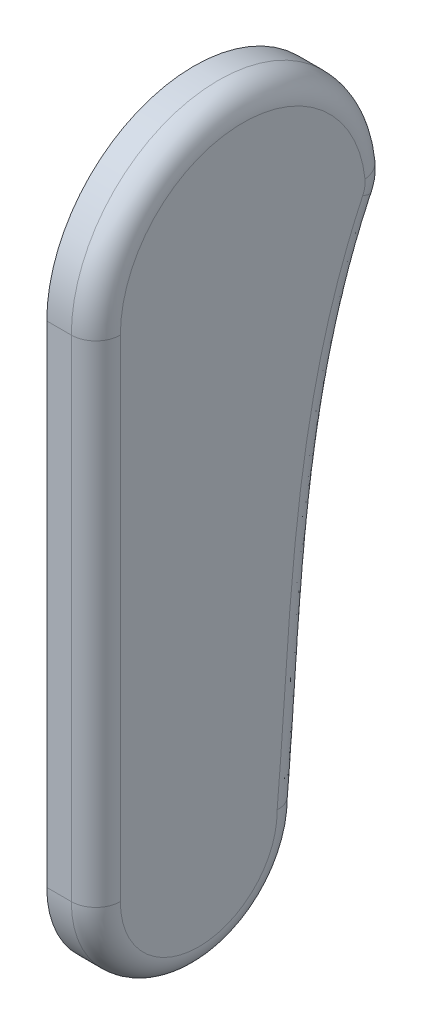
ISO-10303-21;
HEADER;
FILE_DESCRIPTION(('STEP AP214'),'2;1');
FILE_NAME('part.step','',(''),(''),'','','');
FILE_SCHEMA(('AUTOMOTIVE_DESIGN { 1 0 10303 214 1 1 1 1 }'));
ENDSEC;
DATA;
#1=APPLICATION_CONTEXT('core data for automotive mechanical design processes');
#2=APPLICATION_PROTOCOL_DEFINITION('international standard','automotive_design',2000,#1);
#3=PRODUCT_CONTEXT('',#1,'mechanical');
#4=PRODUCT('Part','Part','',(#3));
#5=PRODUCT_RELATED_PRODUCT_CATEGORY('part','',(#4));
#6=PRODUCT_DEFINITION_FORMATION('','',#4);
#7=PRODUCT_DEFINITION_CONTEXT('part definition',#1,'design');
#8=PRODUCT_DEFINITION('design','',#6,#7);
#9=PRODUCT_DEFINITION_SHAPE('','',#8);
#10=(LENGTH_UNIT() NAMED_UNIT(*) SI_UNIT(.MILLI.,.METRE.));
#11=(NAMED_UNIT(*) PLANE_ANGLE_UNIT() SI_UNIT($,.RADIAN.));
#12=(NAMED_UNIT(*) SI_UNIT($,.STERADIAN.) SOLID_ANGLE_UNIT());
#13=UNCERTAINTY_MEASURE_WITH_UNIT(LENGTH_MEASURE(1.E-05),#10,'distance_accuracy_value','');
#14=(GEOMETRIC_REPRESENTATION_CONTEXT(3) GLOBAL_UNCERTAINTY_ASSIGNED_CONTEXT((#13)) GLOBAL_UNIT_ASSIGNED_CONTEXT((#10,
#11,#12)) REPRESENTATION_CONTEXT('',''));
#15=CARTESIAN_POINT('',(0.,0.,0.));
#16=DIRECTION('',(0.,0.,1.));
#17=DIRECTION('',(1.,0.,0.));
#18=AXIS2_PLACEMENT_3D('',#15,#16,#17);
#19=CARTESIAN_POINT('',(10.,50.,0.));
#20=DIRECTION('',(-1.,0.,0.));
#21=DIRECTION('',(0.,0.,1.));
#22=AXIS2_PLACEMENT_3D('',#19,#20,#21);
#23=CYLINDRICAL_SURFACE('',#22,30.);
#24=DIRECTION('',(-1.,0.,0.));
#25=VECTOR('',#24,1.);
#26=CARTESIAN_POINT('',(10.,50.,30.));
#27=LINE('',#26,#25);
#28=CARTESIAN_POINT('',(5.,50.,30.));
#29=VERTEX_POINT('',#28);
#30=CARTESIAN_POINT('',(0.,50.,30.));
#31=VERTEX_POINT('',#30);
#32=EDGE_CURVE('E99',#29,#31,#27,.T.);
#33=ORIENTED_EDGE('',*,*,#32,.F.);
#34=CARTESIAN_POINT('',(5.,50.,0.));
#35=DIRECTION('',(-1.,0.,0.));
#36=DIRECTION('',(0.,0.,1.));
#37=AXIS2_PLACEMENT_3D('',#34,#35,#36);
#38=CIRCLE('',#37,30.);
#39=CARTESIAN_POINT('',(5.,53.1140673162585,-29.8379386813133));
#40=VERTEX_POINT('',#39);
#41=EDGE_CURVE('E65',#29,#40,#38,.T.);
#42=ORIENTED_EDGE('',*,*,#41,.T.);
#43=DIRECTION('',(-1.,0.,0.));
#44=VECTOR('',#43,1.);
#45=CARTESIAN_POINT('',(10.,53.1140673162585,-29.8379386813133));
#46=LINE('',#45,#44);
#47=CARTESIAN_POINT('',(0.,53.1140673162585,-29.8379386813133));
#48=VERTEX_POINT('',#47);
#49=EDGE_CURVE('E122',#40,#48,#46,.T.);
#50=ORIENTED_EDGE('',*,*,#49,.T.);
#51=CARTESIAN_POINT('',(0.,50.,0.));
#52=DIRECTION('',(1.,0.,0.));
#53=DIRECTION('',(0.,0.,1.));
#54=AXIS2_PLACEMENT_3D('',#51,#52,#53);
#55=CIRCLE('',#54,30.);
#56=EDGE_CURVE('E116',#48,#31,#55,.T.);
#57=ORIENTED_EDGE('',*,*,#56,.T.);
#58=EDGE_LOOP('',(#33,#42,#50,#57));
#59=FACE_BOUND('',#58,.T.);
#60=ADVANCED_FACE('F36',(#59),#23,.T.);
#61=CARTESIAN_POINT('',(10.,50.,30.));
#62=DIRECTION('',(0.,0.,-1.));
#63=DIRECTION('',(0.,1.,0.));
#64=AXIS2_PLACEMENT_3D('',#61,#62,#63);
#65=PLANE('',#64);
#66=DIRECTION('',(-1.,0.,0.));
#67=VECTOR('',#66,1.);
#68=CARTESIAN_POINT('',(10.,-50.,30.));
#69=LINE('',#68,#67);
#70=CARTESIAN_POINT('',(5.,-50.,30.));
#71=VERTEX_POINT('',#70);
#72=CARTESIAN_POINT('',(0.,-50.,30.));
#73=VERTEX_POINT('',#72);
#74=EDGE_CURVE('E109',#71,#73,#69,.T.);
#75=ORIENTED_EDGE('',*,*,#74,.F.);
#76=DIRECTION('',(0.,-1.,0.));
#77=VECTOR('',#76,1.);
#78=CARTESIAN_POINT('',(5.,50.,30.));
#79=LINE('',#78,#77);
#80=EDGE_CURVE('E110',#71,#29,#79,.F.);
#81=ORIENTED_EDGE('',*,*,#80,.T.);
#82=ORIENTED_EDGE('',*,*,#32,.T.);
#83=DIRECTION('',(0.,-1.,0.));
#84=VECTOR('',#83,1.);
#85=CARTESIAN_POINT('',(0.,50.,30.));
#86=LINE('',#85,#84);
#87=EDGE_CURVE('E104',#31,#73,#86,.T.);
#88=ORIENTED_EDGE('',*,*,#87,.T.);
#89=EDGE_LOOP('',(#75,#81,#82,#88));
#90=FACE_BOUND('',#89,.T.);
#91=ADVANCED_FACE('F101',(#90),#65,.F.);
#92=CARTESIAN_POINT('',(10.,-50.,9.02085164582259));
#93=DIRECTION('',(-1.,0.,0.));
#94=DIRECTION('',(0.,0.,1.));
#95=AXIS2_PLACEMENT_3D('',#92,#93,#94);
#96=CYLINDRICAL_SURFACE('',#95,20.9791483541774);
#97=DIRECTION('',(-1.,0.,0.));
#98=VECTOR('',#97,1.);
#99=CARTESIAN_POINT('',(10.,-50.,-11.9582967083548));
#100=LINE('',#99,#98);
#101=CARTESIAN_POINT('',(5.,-50.,-11.9582967083548));
#102=VERTEX_POINT('',#101);
#103=CARTESIAN_POINT('',(0.,-50.,-11.9582967083548));
#104=VERTEX_POINT('',#103);
#105=EDGE_CURVE('E147',#102,#104,#100,.T.);
#106=ORIENTED_EDGE('',*,*,#105,.F.);
#107=CARTESIAN_POINT('',(5.,-50.,9.02085164582259));
#108=DIRECTION('',(-1.,0.,0.));
#109=DIRECTION('',(0.,0.,1.));
#110=AXIS2_PLACEMENT_3D('',#107,#108,#109);
#111=CIRCLE('',#110,20.9791483541774);
#112=EDGE_CURVE('E235',#102,#71,#111,.T.);
#113=ORIENTED_EDGE('',*,*,#112,.T.);
#114=ORIENTED_EDGE('',*,*,#74,.T.);
#115=CARTESIAN_POINT('',(0.,-50.,9.02085164582259));
#116=DIRECTION('',(1.,0.,0.));
#117=DIRECTION('',(0.,0.,-1.));
#118=AXIS2_PLACEMENT_3D('',#115,#116,#117);
#119=CIRCLE('',#118,20.9791483541774);
#120=EDGE_CURVE('E118',#73,#104,#119,.T.);
#121=ORIENTED_EDGE('',*,*,#120,.T.);
#122=EDGE_LOOP('',(#106,#113,#114,#121));
#123=FACE_BOUND('',#122,.T.);
#124=ADVANCED_FACE('F217',(#123),#96,.T.);
#125=CARTESIAN_POINT('',(10.,-50.,-11.9582967083548));
#126=CARTESIAN_POINT('',(10.,-26.4513347294721,-14.0777009643891));
#127=CARTESIAN_POINT('',(10.,7.56200178607787,-14.6324379160143));
#128=CARTESIAN_POINT('',(10.,39.226803886699,-24.8825142699617));
#129=CARTESIAN_POINT('',(10.,47.8054191903359,-28.934179879079));
#130=B_SPLINE_CURVE_WITH_KNOTS('',3,(#125,#126,#127,#128,#129),.UNSPECIFIED.,.F.,.F.,(4,1,4),
(0.0235145948170748,0.72514656786816,1.),.UNSPECIFIED.);
#131=DIRECTION('',(-1.,0.,0.));
#132=VECTOR('',#131,1.);
#133=SURFACE_OF_LINEAR_EXTRUSION('',#130,#132);
#134=DIRECTION('',(-1.,0.,0.));
#135=VECTOR('',#134,1.);
#136=CARTESIAN_POINT('',(10.,47.8054191903359,-28.934179879079));
#137=LINE('',#136,#135);
#138=CARTESIAN_POINT('',(5.,47.8054191903359,-28.934179879079));
#139=VERTEX_POINT('',#138);
#140=CARTESIAN_POINT('',(0.,47.8054191903359,-28.934179879079));
#141=VERTEX_POINT('',#140);
#142=EDGE_CURVE('E144',#139,#141,#137,.T.);
#143=ORIENTED_EDGE('',*,*,#142,.F.);
#144=CARTESIAN_POINT('',(10.,73.8872969551826,-35.7229919191395));
#145=CARTESIAN_POINT('',(10.,71.7519841115977,-40.2441022982412));
#146=CARTESIAN_POINT('',(5.,71.7519841115977,-40.2441022982412));
#147=CARTESIAN_POINT('',(10.,65.9051086480953,-31.9530177794187));
#148=CARTESIAN_POINT('',(10.,63.7697957392722,-36.4741281277085));
#149=CARTESIAN_POINT('',(5.,63.7697957392722,-36.4741281277086));
#150=CARTESIAN_POINT('',(10.,57.922920341008,-28.183043639698));
#151=CARTESIAN_POINT('',(10.,55.7876073669467,-32.7041539571759));
#152=CARTESIAN_POINT('',(5.,55.7876073669467,-32.7041539571759));
#153=CARTESIAN_POINT('',(10.,49.9407320339208,-24.4130694999772));
#154=CARTESIAN_POINT('',(10.,47.8054189946213,-28.9341797866433));
#155=CARTESIAN_POINT('',(5.,47.8054189946213,-28.9341797866433));
#156=CARTESIAN_POINT('',(10.,48.93338079189,-23.9372754970616));
#157=CARTESIAN_POINT('',(10.,46.8408478290238,-28.4785934806703));
#158=CARTESIAN_POINT('',(5.,46.8408478290238,-28.4785934806703));
#159=CARTESIAN_POINT('',(10.,47.9192862922163,-23.4758298749053));
#160=CARTESIAN_POINT('',(10.,45.8692859154033,-28.0364906090797));
#161=CARTESIAN_POINT('',(5.,45.8692859154033,-28.0364906090797));
#162=CARTESIAN_POINT('',(10.,45.878803111166,-22.5811525083814));
#163=CARTESIAN_POINT('',(10.,43.913160956854,-27.1788003005188));
#164=CARTESIAN_POINT('',(5.,43.913160956854,-27.1788003005188));
#165=CARTESIAN_POINT('',(10.,44.8524152549784,-22.1479188827161));
#166=CARTESIAN_POINT('',(10.,42.9285987841157,-26.7632110955404));
#167=CARTESIAN_POINT('',(5.,42.9285987841156,-26.7632110955404));
#168=CARTESIAN_POINT('',(10.,42.7889844473,-21.3093555749802));
#169=CARTESIAN_POINT('',(10.,40.9478828804291,-25.9582628509131));
#170=CARTESIAN_POINT('',(5.,40.9478828804291,-25.9582628509131));
#171=CARTESIAN_POINT('',(10.,41.7519478259179,-20.9040103064838));
#172=CARTESIAN_POINT('',(10.,39.9517359940092,-25.5688891624172));
#173=CARTESIAN_POINT('',(5.,39.9517359940092,-25.5688891624172));
#174=CARTESIAN_POINT('',(10.,39.6677509013511,-20.1202731407733));
#175=CARTESIAN_POINT('',(10.,37.9482207436012,-24.8154913103112));
#176=CARTESIAN_POINT('',(5.,37.9482207436012,-24.8154913103112));
#177=CARTESIAN_POINT('',(10.,38.6205904302427,-19.7418816915146));
#178=CARTESIAN_POINT('',(10.,36.9408521934375,-24.4514675680035));
#179=CARTESIAN_POINT('',(5.,36.9408521934375,-24.4514675680035));
#180=CARTESIAN_POINT('',(10.,35.4741117020138,-18.648978166377));
#181=CARTESIAN_POINT('',(10.,33.911524484684,-23.3992555619152));
#182=CARTESIAN_POINT('',(5.,33.911524484684,-23.3992555619152));
#183=CARTESIAN_POINT('',(10.,33.3612060632632,-17.9732665296684));
#184=CARTESIAN_POINT('',(10.,31.8740996925733,-22.7475946117214));
#185=CARTESIAN_POINT('',(5.,31.8740996925733,-22.7475946117214));
#186=CARTESIAN_POINT('',(10.,29.1068905501268,-16.7182671285238));
#187=CARTESIAN_POINT('',(10.,27.764636811756,-21.5353269218243));
#188=CARTESIAN_POINT('',(5.,27.764636811756,-21.5353269218243));
#189=CARTESIAN_POINT('',(10.,26.9654765921235,-16.1389933421835));
#190=CARTESIAN_POINT('',(10.,25.6925937531463,-20.9747333820878));
#191=CARTESIAN_POINT('',(5.,25.6925937531463,-20.9747333820878));
#192=CARTESIAN_POINT('',(10.,22.6660774498272,-15.0695476057356));
#193=CARTESIAN_POINT('',(10.,21.5249239755849,-19.9380555366966));
#194=CARTESIAN_POINT('',(5.,21.5249239755848,-19.9380555366966));
#195=CARTESIAN_POINT('',(10.,20.5081443738661,-14.5791651386936));
#196=CARTESIAN_POINT('',(10.,19.429365795938,-19.4617716292313));
#197=CARTESIAN_POINT('',(5.,19.429365795938,-19.4617716292313));
#198=CARTESIAN_POINT('',(10.,16.176261998319,-13.6764042571045));
#199=CARTESIAN_POINT('',(10.,15.2148934433323,-18.5834759878851));
#200=CARTESIAN_POINT('',(5.,15.2148934433323,-18.5834759878851));
#201=CARTESIAN_POINT('',(10.,14.0023132353014,-13.2640232415366));
#202=CARTESIAN_POINT('',(10.,13.0959800516661,-18.1814617774323));
#203=CARTESIAN_POINT('',(5.,13.0959800516661,-18.1814617774323));
#204=CARTESIAN_POINT('',(10.,7.45859228737297,-12.1281536782276));
#205=CARTESIAN_POINT('',(10.,6.70598016154818,-17.0722937120038));
#206=CARTESIAN_POINT('',(5.,6.70598016154818,-17.0722937120038));
#207=CARTESIAN_POINT('',(10.,3.0710823137922,-11.5069256051738));
#208=CARTESIAN_POINT('',(10.,2.40564318449559,-16.4629730472704));
#209=CARTESIAN_POINT('',(5.,2.40564318449558,-16.4629730472705));
#210=CARTESIAN_POINT('',(10.,-5.7130041076635,-10.4559169434817));
#211=CARTESIAN_POINT('',(10.,-6.23572488046773,-15.4290324209686));
#212=CARTESIAN_POINT('',(5.,-6.23572488046772,-15.4290324209685));
#213=CARTESIAN_POINT('',(10.,-10.1095234240287,-10.0256201558454));
#214=CARTESIAN_POINT('',(10.,-10.5766134450412,-15.0039145256099));
#215=CARTESIAN_POINT('',(5.,-10.5766134450411,-15.0039145256093));
#216=CARTESIAN_POINT('',(10.,-18.9098479221754,-9.27125410761063));
#217=CARTESIAN_POINT('',(10.,-19.296904848253,-14.2564146094276));
#218=CARTESIAN_POINT('',(5.,-19.296904848253,-14.2564146094282));
#219=CARTESIAN_POINT('',(10.,-23.3136506231671,-8.94715409724267));
#220=CARTESIAN_POINT('',(10.,-23.6762961604362,-13.934002850319));
#221=CARTESIAN_POINT('',(5.,-23.6762961604364,-13.9340028503212));
#222=CARTESIAN_POINT('',(10.,-29.5382476317133,-8.50505763528955));
#223=CARTESIAN_POINT('',(10.,-29.8889765513778,-13.4927384351559));
#224=CARTESIAN_POINT('',(5.,-29.8889765513777,-13.492738435155));
#225=CARTESIAN_POINT('',(10.,-31.3584685191052,-8.37771178703263));
#226=CARTESIAN_POINT('',(10.,-31.708441663138,-13.3654481251371));
#227=CARTESIAN_POINT('',(5.,-31.7084416631378,-13.3654481251346));
#228=CARTESIAN_POINT('',(10.,-34.9987365190319,-8.12079273940109));
#229=CARTESIAN_POINT('',(10.,-35.3527871222883,-13.1082431445607));
#230=CARTESIAN_POINT('',(5.,-35.3527871222886,-13.1082431445631));
#231=CARTESIAN_POINT('',(10.,-36.8187836336732,-7.99121957178806));
#232=CARTESIAN_POINT('',(10.,-37.1776673921517,-12.9783285114213));
#233=CARTESIAN_POINT('',(5.,-37.1776673921525,-12.9783285114302));
#234=CARTESIAN_POINT('',(10.,-40.4583662913879,-7.72365912987904));
#235=CARTESIAN_POINT('',(10.,-40.8326629873264,-12.7096362934499));
#236=CARTESIAN_POINT('',(5.,-40.8326629873256,-12.7096362934411));
#237=CARTESIAN_POINT('',(10.,-42.2779018040432,-7.58567143170009));
#238=CARTESIAN_POINT('',(10.,-42.6627785719339,-12.5708582621065));
#239=CARTESIAN_POINT('',(5.,-42.6627785719309,-12.5708582620735));
#240=CARTESIAN_POINT('',(10.,-45.9158591065057,-7.29482003890449));
#241=CARTESIAN_POINT('',(10.,-46.3278633718317,-12.2778316724073));
#242=CARTESIAN_POINT('',(5.,-46.3278633718346,-12.2778316724403));
#243=CARTESIAN_POINT('',(10.,-47.7342808410477,-7.14195565815256));
#244=CARTESIAN_POINT('',(10.,-48.1628328071883,-12.1235824004843));
#245=CARTESIAN_POINT('',(5.,-48.1628328071994,-12.1235824006074));
#246=CARTESIAN_POINT('',(10.,-49.5518065134865,-6.97842496280876));
#247=CARTESIAN_POINT('',(10.,-49.9999997897036,-11.9582967269362));
#248=CARTESIAN_POINT('',(5.,-49.9999997897344,-11.9582967272789));
#249=CARTESIAN_POINT('',(10.,-51.0749034454428,-6.84134466207697));
#250=CARTESIAN_POINT('',(10.,-51.5230968382625,-11.8212164157101));
#251=CARTESIAN_POINT('',(5.,-51.5230968382826,-11.8212164159338));
#252=CARTESIAN_POINT('',(10.,-52.5980003773987,-6.70426436134043));
#253=CARTESIAN_POINT('',(10.,-53.0461938821737,-11.6841361048974));
#254=CARTESIAN_POINT('',(5.,-53.0461938821835,-11.6841361050069));
#255=CARTESIAN_POINT('',(10.,-89.289691386705,-3.40197418352203));
#256=CARTESIAN_POINT('',(10.,-89.7378874765488,-8.38184569442024));
#257=CARTESIAN_POINT('',(5.,-89.7378874763214,-8.38184569189182));
#258=CARTESIAN_POINT('',(10.,-124.458285463828,-0.236764303916523));
#259=CARTESIAN_POINT('',(10.,-124.906481553672,-5.21663581481474));
#260=CARTESIAN_POINT('',(5.,-124.906481553445,-5.21663581228631));
#261=CARTESIAN_POINT('',(10.,-159.626879540724,2.92844557821737));
#262=CARTESIAN_POINT('',(10.,-160.075073152807,-2.05142615568181));
#263=CARTESIAN_POINT('',(5.,-160.075073152807,-2.05142615568181));
#264=(BOUNDED_SURFACE() B_SPLINE_SURFACE(3,2,((#144,#145,#146),(#147,#148,#149),(#150,#151,
#152),(#153,#154,#155),(#156,#157,#158),(#159,#160,#161),(#162,#163,#164),(#165,#166,#167),
(#168,#169,#170),(#171,#172,#173),(#174,#175,#176),(#177,#178,#179),(#180,#181,#182),(#183,#184,
#185),(#186,#187,#188),(#189,#190,#191),(#192,#193,#194),(#195,#196,#197),(#198,#199,#200),
(#201,#202,#203),(#204,#205,#206),(#207,#208,#209),(#210,#211,#212),(#213,#214,#215),(#216,#217,
#218),(#219,#220,#221),(#222,#223,#224),(#225,#226,#227),(#228,#229,#230),(#231,#232,#233),
(#234,#235,#236),(#237,#238,#239),(#240,#241,#242),(#243,#244,#245),(#246,#247,#248),(#249,#250,
#251),(#252,#253,#254),(#255,#256,#257),(#258,#259,#260),(#261,#262,#263)),.UNSPECIFIED.,.F.,
.F.,.F.) B_SPLINE_SURFACE_WITH_KNOTS((4,3,2,2,2,2,2,2,2,2,2,2,2,2,2,2,3,2,4),(3,3),(0.,
26.4830571621872,29.8250875965929,33.1668949412929,36.5068191630459,39.8467988792977,
46.4989965496698,53.1521575788284,59.7893503167017,66.4263216930438,79.7129978270955,
92.9635301091096,106.210222240548,111.684254067958,117.158207900267,122.632437711799,
128.106920122917,132.694679647657,238.626908296406),(0.,1.),
.UNSPECIFIED.) GEOMETRIC_REPRESENTATION_ITEM() RATIONAL_B_SPLINE_SURFACE(((1.,0.707106781186548,
1.),(1.,0.707106781186548,1.),(1.,0.707106781186548,1.),(1.,0.707106781186548,1.),(1.,
0.707106781186548,1.),(1.,0.707106781186548,1.),(1.,0.707106781186548,1.),(1.,0.707106781186548,
1.),(1.,0.707106781186548,1.),(1.,0.707106781186548,1.),(1.,0.707106781186548,1.),(1.,
0.707106781186548,1.),(1.,0.707106781186548,1.),(1.,0.707106781186548,1.),(1.,0.707106781186548,
1.),(1.,0.707106781186548,1.),(1.,0.707106781186548,1.),(1.,0.707106781186548,1.),(1.,
0.707106781186548,1.),(1.,0.707106781186548,1.),(1.,0.707106781186548,1.),(1.,0.707106781186548,
1.),(1.,0.707106781186548,1.),(1.,0.707106781186548,1.),(1.,0.707106781186548,1.),(1.,
0.707106781186548,1.),(1.,0.707106781186548,1.),(1.,0.707106781186548,1.),(1.,0.707106781186548,
1.),(1.,0.707106781186548,1.),(1.,0.707106781186548,1.),(1.,0.707106781186548,1.),(1.,
0.707106781186548,1.),(1.,0.707106781186548,1.),(1.,0.707106781186548,1.),(1.,0.707106781186548,
1.),(1.,0.707106781186548,1.),(1.,0.707106781186548,1.),(1.,0.707106781186548,1.),(1.,
0.707106781186548,1.))) REPRESENTATION_ITEM('') SURFACE());
#265=CARTESIAN_POINT('',(5.,71.7519841115977,-40.2441022982412));
#266=CARTESIAN_POINT('',(5.,63.7697957392722,-36.4741281277086));
#267=CARTESIAN_POINT('',(5.,55.7876073669467,-32.7041539571759));
#268=CARTESIAN_POINT('',(5.,47.8054189946213,-28.9341797866433));
#269=CARTESIAN_POINT('',(5.,46.8408478290238,-28.4785934806703));
#270=CARTESIAN_POINT('',(5.,45.8692859154033,-28.0364906090797));
#271=CARTESIAN_POINT('',(5.,43.913160956854,-27.1788003005188));
#272=CARTESIAN_POINT('',(5.,42.9285987841156,-26.7632110955404));
#273=CARTESIAN_POINT('',(5.,40.9478828804291,-25.9582628509131));
#274=CARTESIAN_POINT('',(5.,39.9517359940092,-25.5688891624172));
#275=CARTESIAN_POINT('',(5.,37.9482207436012,-24.8154913103112));
#276=CARTESIAN_POINT('',(5.,36.9408521934375,-24.4514675680035));
#277=CARTESIAN_POINT('',(5.,33.911524484684,-23.3992555619152));
#278=CARTESIAN_POINT('',(5.,31.8740996925733,-22.7475946117214));
#279=CARTESIAN_POINT('',(5.,27.764636811756,-21.5353269218243));
#280=CARTESIAN_POINT('',(5.,25.6925937531463,-20.9747333820878));
#281=CARTESIAN_POINT('',(5.,21.5249239755848,-19.9380555366966));
#282=CARTESIAN_POINT('',(5.,19.429365795938,-19.4617716292313));
#283=CARTESIAN_POINT('',(5.,15.2148934433323,-18.5834759878851));
#284=CARTESIAN_POINT('',(5.,13.0959800516661,-18.1814617774323));
#285=CARTESIAN_POINT('',(5.,6.70598016154818,-17.0722937120038));
#286=CARTESIAN_POINT('',(5.,2.40564318449558,-16.4629730472705));
#287=CARTESIAN_POINT('',(5.,-6.23572488046772,-15.4290324209685));
#288=CARTESIAN_POINT('',(5.,-10.5766134450411,-15.0039145256093));
#289=CARTESIAN_POINT('',(5.,-19.296904848253,-14.2564146094282));
#290=CARTESIAN_POINT('',(5.,-23.6762961604364,-13.9340028503212));
#291=CARTESIAN_POINT('',(5.,-29.8889765513777,-13.492738435155));
#292=CARTESIAN_POINT('',(5.,-31.7084416631378,-13.3654481251346));
#293=CARTESIAN_POINT('',(5.,-35.3527871222886,-13.1082431445631));
#294=CARTESIAN_POINT('',(5.,-37.1776673921525,-12.9783285114302));
#295=CARTESIAN_POINT('',(5.,-40.8326629873256,-12.7096362934411));
#296=CARTESIAN_POINT('',(5.,-42.6627785719309,-12.5708582620735));
#297=CARTESIAN_POINT('',(5.,-46.3278633718346,-12.2778316724403));
#298=CARTESIAN_POINT('',(5.,-48.1628328071994,-12.1235824006074));
#299=CARTESIAN_POINT('',(5.,-49.9999997897344,-11.9582967272789));
#300=CARTESIAN_POINT('',(5.,-51.5230968382826,-11.8212164159338));
#301=CARTESIAN_POINT('',(5.,-53.0461938821835,-11.6841361050069));
#302=CARTESIAN_POINT('',(5.,-89.7378874763213,-8.38184569189182));
#303=CARTESIAN_POINT('',(5.,-124.906481553445,-5.21663581228632));
#304=CARTESIAN_POINT('',(5.,-160.075073152807,-2.05142615568181));
#305=B_SPLINE_CURVE_WITH_KNOTS('',3,(#265,#266,#267,#268,#269,#270,#271,#272,#273,#274,#275,
#276,#277,#278,#279,#280,#281,#282,#283,#284,#285,#286,#287,#288,#289,#290,#291,#292,#293,#294,
#295,#296,#297,#298,#299,#300,#301,#302,#303,#304),.UNSPECIFIED.,.F.,.F.,(4,3,2,2,2,2,2,2,2,2,2,
2,2,2,2,2,3,2,4),(0.,26.4830571621872,29.8250875965929,33.1668949412929,36.5068191630459,
39.8467988792977,46.4989965496698,53.1521575788284,59.7893503167017,66.4263216930438,
79.7129978270955,92.9635301091096,106.210222240548,111.684254067958,117.158207900267,
122.632437711799,128.106920122917,132.694679647657,238.626908296406),.UNSPECIFIED.);
#306=EDGE_CURVE('E11',#139,#102,#305,.T.);
#307=ORIENTED_EDGE('',*,*,#306,.T.);
#308=ORIENTED_EDGE('',*,*,#105,.T.);
#309=CARTESIAN_POINT('',(0.,-50.,-11.9582967083548));
#310=CARTESIAN_POINT('',(0.,-26.4513347294721,-14.0777009643891));
#311=CARTESIAN_POINT('',(0.,7.56200178607787,-14.6324379160143));
#312=CARTESIAN_POINT('',(0.,39.226803886699,-24.8825142699617));
#313=CARTESIAN_POINT('',(0.,47.8054191903359,-28.934179879079));
#314=B_SPLINE_CURVE_WITH_KNOTS('',3,(#309,#310,#311,#312,#313),.UNSPECIFIED.,.F.,.F.,(4,1,4),
(0.0235145948170748,0.72514656786816,1.),.UNSPECIFIED.);
#315=EDGE_CURVE('E133',#104,#141,#314,.T.);
#316=ORIENTED_EDGE('',*,*,#315,.T.);
#317=EDGE_LOOP('',(#143,#307,#308,#316));
#318=FACE_BOUND('',#317,.T.);
#319=ADVANCED_FACE('F185',(#318),#133,.F.);
#320=CARTESIAN_POINT('',(10.,52.0760448775057,-19.8919591208755));
#321=DIRECTION('',(-1.,0.,0.));
#322=DIRECTION('',(0.,0.,1.));
#323=AXIS2_PLACEMENT_3D('',#320,#321,#322);
#324=CYLINDRICAL_SURFACE('',#323,10.);
#325=ORIENTED_EDGE('',*,*,#49,.F.);
#326=CARTESIAN_POINT('',(5.,52.0760448775057,-19.8919591208755));
#327=DIRECTION('',(-1.,0.,0.));
#328=DIRECTION('',(0.,0.,1.));
#329=AXIS2_PLACEMENT_3D('',#326,#327,#328);
#330=CIRCLE('',#329,10.);
#331=EDGE_CURVE('E50',#40,#139,#330,.T.);
#332=ORIENTED_EDGE('',*,*,#331,.T.);
#333=ORIENTED_EDGE('',*,*,#142,.T.);
#334=CARTESIAN_POINT('',(0.,52.0760448775057,-19.8919591208755));
#335=DIRECTION('',(1.,0.,0.));
#336=DIRECTION('',(0.,0.,1.));
#337=AXIS2_PLACEMENT_3D('',#334,#335,#336);
#338=CIRCLE('',#337,10.);
#339=EDGE_CURVE('E140',#141,#48,#338,.T.);
#340=ORIENTED_EDGE('',*,*,#339,.T.);
#341=EDGE_LOOP('',(#325,#332,#333,#340));
#342=FACE_BOUND('',#341,.T.);
#343=ADVANCED_FACE('F227',(#342),#324,.T.);
#344=CARTESIAN_POINT('',(10.,50.,0.));
#345=DIRECTION('',(-1.,0.,0.));
#346=DIRECTION('',(0.,0.,1.));
#347=AXIS2_PLACEMENT_3D('',#344,#345,#346);
#348=PLANE('',#347);
#349=DIRECTION('',(0.,-1.,0.));
#350=VECTOR('',#349,1.);
#351=CARTESIAN_POINT('',(10.,50.,25.));
#352=LINE('',#351,#350);
#353=CARTESIAN_POINT('',(10.,50.,25.));
#354=VERTEX_POINT('',#353);
#355=CARTESIAN_POINT('',(10.,-50.,25.));
#356=VERTEX_POINT('',#355);
#357=EDGE_CURVE('E410',#354,#356,#352,.T.);
#358=ORIENTED_EDGE('',*,*,#357,.T.);
#359=CARTESIAN_POINT('',(10.,-50.,9.02085164582259));
#360=DIRECTION('',(-1.,0.,0.));
#361=DIRECTION('',(0.,0.,1.));
#362=AXIS2_PLACEMENT_3D('',#359,#360,#361);
#363=CIRCLE('',#362,15.9791483541774);
#364=CARTESIAN_POINT('',(10.,-49.79068440039,-6.95692570600488));
#365=VERTEX_POINT('',#364);
#366=EDGE_CURVE('E240',#356,#365,#363,.F.);
#367=ORIENTED_EDGE('',*,*,#366,.T.);
#368=CARTESIAN_POINT('',(10.,-159.626879540724,2.92844557821737));
#369=CARTESIAN_POINT('',(10.,-124.458285463828,-0.236764303916532));
#370=CARTESIAN_POINT('',(10.,-89.2896913867049,-3.40197418352204));
#371=CARTESIAN_POINT('',(10.,-52.5980003773987,-6.70426436134043));
#372=CARTESIAN_POINT('',(10.,-51.0749034454428,-6.84134466207697));
#373=CARTESIAN_POINT('',(10.,-49.5518065134865,-6.97842496280876));
#374=CARTESIAN_POINT('',(10.,-47.7342808410477,-7.14195565815256));
#375=CARTESIAN_POINT('',(10.,-45.9158591065057,-7.29482003890449));
#376=CARTESIAN_POINT('',(10.,-42.2779018040432,-7.58567143170009));
#377=CARTESIAN_POINT('',(10.,-40.4583662913879,-7.72365912987904));
#378=CARTESIAN_POINT('',(10.,-36.8187836336732,-7.99121957178806));
#379=CARTESIAN_POINT('',(10.,-34.9987365190319,-8.12079273940109));
#380=CARTESIAN_POINT('',(10.,-31.3584685191052,-8.37771178703263));
#381=CARTESIAN_POINT('',(10.,-29.5382476317133,-8.50505763528954));
#382=CARTESIAN_POINT('',(10.,-23.3136506231671,-8.94715409724267));
#383=CARTESIAN_POINT('',(10.,-18.9098479221754,-9.27125410761063));
#384=CARTESIAN_POINT('',(10.,-10.1095234240287,-10.0256201558454));
#385=CARTESIAN_POINT('',(10.,-5.7130041076635,-10.4559169434817));
#386=CARTESIAN_POINT('',(10.,3.07108231379221,-11.5069256051738));
#387=CARTESIAN_POINT('',(10.,7.45859228737297,-12.1281536782276));
#388=CARTESIAN_POINT('',(10.,14.0023132353014,-13.2640232415366));
#389=CARTESIAN_POINT('',(10.,16.176261998319,-13.6764042571045));
#390=CARTESIAN_POINT('',(10.,20.5081443738661,-14.5791651386936));
#391=CARTESIAN_POINT('',(10.,22.6660774498272,-15.0695476057356));
#392=CARTESIAN_POINT('',(10.,26.9654765921235,-16.1389933421835));
#393=CARTESIAN_POINT('',(10.,29.1068905501268,-16.7182671285238));
#394=CARTESIAN_POINT('',(10.,33.3612060632632,-17.9732665296684));
#395=CARTESIAN_POINT('',(10.,35.4741117020138,-18.648978166377));
#396=CARTESIAN_POINT('',(10.,38.6205904302427,-19.7418816915146));
#397=CARTESIAN_POINT('',(10.,39.6677509013511,-20.1202731407733));
#398=CARTESIAN_POINT('',(10.,41.7519478259179,-20.9040103064838));
#399=CARTESIAN_POINT('',(10.,42.7889844473,-21.3093555749802));
#400=CARTESIAN_POINT('',(10.,44.8524152549784,-22.1479188827161));
#401=CARTESIAN_POINT('',(10.,45.878803111166,-22.5811525083814));
#402=CARTESIAN_POINT('',(10.,47.9192862922163,-23.4758298749053));
#403=CARTESIAN_POINT('',(10.,48.93338079189,-23.9372754970616));
#404=CARTESIAN_POINT('',(10.,49.9407320339208,-24.4130694999772));
#405=CARTESIAN_POINT('',(10.,57.922920341008,-28.183043639698));
#406=CARTESIAN_POINT('',(10.,65.9051086480953,-31.9530177794187));
#407=CARTESIAN_POINT('',(10.,73.8872969551826,-35.7229919191395));
#408=B_SPLINE_CURVE_WITH_KNOTS('',3,(#368,#369,#370,#371,#372,#373,#374,#375,#376,#377,#378,
#379,#380,#381,#382,#383,#384,#385,#386,#387,#388,#389,#390,#391,#392,#393,#394,#395,#396,#397,
#398,#399,#400,#401,#402,#403,#404,#405,#406,#407),.UNSPECIFIED.,.F.,.F.,(4,2,3,2,2,2,2,2,2,2,2,
2,2,2,2,2,2,3,4),(0.,105.932228648749,110.51998817349,115.994470584608,121.46870039614,
126.942654228448,132.416686055858,145.663378187297,158.913910469311,172.200586603362,
178.837557979704,185.474750717578,192.127911746736,198.780109417108,202.12008913336,
205.460013355113,208.801820699813,212.143851134219,238.626908296406),.UNSPECIFIED.);
#409=CARTESIAN_POINT('',(10.,49.9407320339208,-24.4130694999772));
#410=VERTEX_POINT('',#409);
#411=EDGE_CURVE('E107',#365,#410,#408,.T.);
#412=ORIENTED_EDGE('',*,*,#411,.T.);
#413=CARTESIAN_POINT('',(10.,52.0760448775057,-19.8919591208755));
#414=DIRECTION('',(-1.,0.,0.));
#415=DIRECTION('',(0.,0.,1.));
#416=AXIS2_PLACEMENT_3D('',#413,#414,#415);
#417=CIRCLE('',#416,5.);
#418=CARTESIAN_POINT('',(10.,52.5950560968821,-24.8649489010944));
#419=VERTEX_POINT('',#418);
#420=EDGE_CURVE('E156',#410,#419,#417,.F.);
#421=ORIENTED_EDGE('',*,*,#420,.T.);
#422=CARTESIAN_POINT('',(10.,50.,0.));
#423=DIRECTION('',(-1.,0.,0.));
#424=DIRECTION('',(0.,0.,1.));
#425=AXIS2_PLACEMENT_3D('',#422,#423,#424);
#426=CIRCLE('',#425,25.);
#427=EDGE_CURVE('E394',#419,#354,#426,.F.);
#428=ORIENTED_EDGE('',*,*,#427,.T.);
#429=EDGE_LOOP('',(#358,#367,#412,#421,#428));
#430=FACE_BOUND('',#429,.T.);
#431=ADVANCED_FACE('F159',(#430),#348,.F.);
#432=CARTESIAN_POINT('',(0.,50.,0.));
#433=DIRECTION('',(-1.,0.,0.));
#434=DIRECTION('',(0.,0.,1.));
#435=AXIS2_PLACEMENT_3D('',#432,#433,#434);
#436=PLANE('',#435);
#437=CARTESIAN_POINT('',(0.,40.664211337114,3.52267857990561));
#438=DIRECTION('',(-1.,0.,0.));
#439=DIRECTION('',(0.,0.,1.));
#440=AXIS2_PLACEMENT_3D('',#437,#438,#439);
#441=CIRCLE('',#440,2.2499999999978);
#442=CARTESIAN_POINT('',(0.,40.664211337114,5.77267857990341));
#443=VERTEX_POINT('',#442);
#444=EDGE_CURVE('E253',#443,#443,#441,.T.);
#445=ORIENTED_EDGE('',*,*,#444,.F.);
#446=EDGE_LOOP('',(#445));
#447=FACE_BOUND('',#446,.T.);
#448=CARTESIAN_POINT('',(0.,59.3749329826269,-3.54194423409759));
#449=DIRECTION('',(-1.,0.,0.));
#450=DIRECTION('',(0.,0.,1.));
#451=AXIS2_PLACEMENT_3D('',#448,#449,#450);
#452=CIRCLE('',#451,2.2499999999978);
#453=CARTESIAN_POINT('',(0.,59.3749329826269,-1.29194423409979));
#454=VERTEX_POINT('',#453);
#455=EDGE_CURVE('E249',#454,#454,#452,.T.);
#456=ORIENTED_EDGE('',*,*,#455,.F.);
#457=EDGE_LOOP('',(#456));
#458=FACE_BOUND('',#457,.T.);
#459=CARTESIAN_POINT('',(0.,50.0195721598704,-0.00963282709598966));
#460=DIRECTION('',(-1.,0.,0.));
#461=DIRECTION('',(0.,0.,1.));
#462=AXIS2_PLACEMENT_3D('',#459,#460,#461);
#463=CIRCLE('',#462,1.37620578965432);
#464=CARTESIAN_POINT('',(0.,50.0195721598704,1.36657296255833));
#465=VERTEX_POINT('',#464);
#466=EDGE_CURVE('E244',#465,#465,#463,.T.);
#467=ORIENTED_EDGE('',*,*,#466,.F.);
#468=EDGE_LOOP('',(#467));
#469=FACE_BOUND('',#468,.T.);
#470=ORIENTED_EDGE('',*,*,#56,.F.);
#471=ORIENTED_EDGE('',*,*,#339,.F.);
#472=ORIENTED_EDGE('',*,*,#315,.F.);
#473=ORIENTED_EDGE('',*,*,#120,.F.);
#474=ORIENTED_EDGE('',*,*,#87,.F.);
#475=EDGE_LOOP('',(#470,#471,#472,#473,#474));
#476=FACE_BOUND('',#475,.T.);
#477=ADVANCED_FACE('F112',(#447,#458,#469,#476),#436,.T.);
#478=CARTESIAN_POINT('',(5.,50.,0.));
#479=DIRECTION('',(-1.,0.,0.));
#480=DIRECTION('',(0.,0.,1.));
#481=AXIS2_PLACEMENT_3D('',#478,#479,#480);
#482=TOROIDAL_SURFACE('',#481,25.,5.);
#483=CARTESIAN_POINT('',(5.,50.,25.));
#484=DIRECTION('',(0.,-1.,0.));
#485=DIRECTION('',(0.,0.,-1.));
#486=AXIS2_PLACEMENT_3D('',#483,#484,#485);
#487=CIRCLE('',#486,5.);
#488=EDGE_CURVE('E123',#354,#29,#487,.T.);
#489=ORIENTED_EDGE('',*,*,#488,.F.);
#490=ORIENTED_EDGE('',*,*,#427,.F.);
#491=CARTESIAN_POINT('',(5.,52.5950560968821,-24.8649489010944));
#492=DIRECTION('',(0.,-0.994597956043776,-0.103802243875282));
#493=DIRECTION('',(0.,0.103802243875283,-0.994597956043776));
#494=AXIS2_PLACEMENT_3D('',#491,#492,#493);
#495=CIRCLE('',#494,5.);
#496=EDGE_CURVE('E45',#40,#419,#495,.T.);
#497=ORIENTED_EDGE('',*,*,#496,.F.);
#498=ORIENTED_EDGE('',*,*,#41,.F.);
#499=EDGE_LOOP('',(#489,#490,#497,#498));
#500=FACE_BOUND('',#499,.T.);
#501=ADVANCED_FACE('F37',(#500),#482,.T.);
#502=CARTESIAN_POINT('',(5.,52.0760448775057,-19.8919591208755));
#503=DIRECTION('',(-1.,0.,0.));
#504=DIRECTION('',(0.,0.,1.));
#505=AXIS2_PLACEMENT_3D('',#502,#503,#504);
#506=TOROIDAL_SURFACE('',#505,5.,5.);
#507=ORIENTED_EDGE('',*,*,#496,.T.);
#508=ORIENTED_EDGE('',*,*,#420,.F.);
#509=CARTESIAN_POINT('',(5.,49.9407320339208,-24.4130694999772));
#510=DIRECTION('',(0.,-0.904222075820346,0.427062568716979));
#511=DIRECTION('',(0.,-0.427062568716979,-0.904222075820346));
#512=AXIS2_PLACEMENT_3D('',#509,#510,#511);
#513=CIRCLE('',#512,5.);
#514=EDGE_CURVE('E243',#139,#410,#513,.T.);
#515=ORIENTED_EDGE('',*,*,#514,.F.);
#516=ORIENTED_EDGE('',*,*,#331,.F.);
#517=EDGE_LOOP('',(#507,#508,#515,#516));
#518=FACE_BOUND('',#517,.T.);
#519=ADVANCED_FACE('F210',(#518),#506,.T.);
#520=CARTESIAN_POINT('',(5.,50.,25.));
#521=DIRECTION('',(0.,-1.,0.));
#522=DIRECTION('',(0.,0.,-1.));
#523=AXIS2_PLACEMENT_3D('',#520,#521,#522);
#524=CYLINDRICAL_SURFACE('',#523,5.);
#525=ORIENTED_EDGE('',*,*,#488,.T.);
#526=ORIENTED_EDGE('',*,*,#80,.F.);
#527=CARTESIAN_POINT('',(5.,-50.,25.));
#528=DIRECTION('',(0.,-1.,0.));
#529=DIRECTION('',(0.,0.,-1.));
#530=AXIS2_PLACEMENT_3D('',#527,#528,#529);
#531=CIRCLE('',#530,5.);
#532=EDGE_CURVE('E198',#356,#71,#531,.T.);
#533=ORIENTED_EDGE('',*,*,#532,.F.);
#534=ORIENTED_EDGE('',*,*,#357,.F.);
#535=EDGE_LOOP('',(#525,#526,#533,#534));
#536=FACE_BOUND('',#535,.T.);
#537=ADVANCED_FACE('F174',(#536),#524,.T.);
#538=ORIENTED_EDGE('',*,*,#514,.T.);
#539=ORIENTED_EDGE('',*,*,#411,.F.);
#540=CARTESIAN_POINT('',(5.,-50.,-11.9582967083548));
#541=CARTESIAN_POINT('',(5.14051896522251,-50.0000009207387,-11.9583118791225));
#542=CARTESIAN_POINT('',(5.28103571034407,-49.9997340032627,-11.952373672152));
#543=CARTESIAN_POINT('',(5.561063207991,-49.9986711489991,-11.9287001028759));
#544=CARTESIAN_POINT('',(5.70057401010191,-49.9978752384698,-11.9109653261283));
#545=CARTESIAN_POINT('',(5.97750299293431,-49.9957618112271,-11.8638250875052));
#546=CARTESIAN_POINT('',(6.11492260109219,-49.9944446685686,-11.8344279948902));
#547=CARTESIAN_POINT('',(6.38679392940835,-49.9913017998767,-11.7641779792649));
#548=CARTESIAN_POINT('',(6.52124568469789,-49.9894760798668,-11.7233251919374));
#549=CARTESIAN_POINT('',(6.78626643529376,-49.9853329687694,-11.6304404128933));
#550=CARTESIAN_POINT('',(6.91683429739439,-49.983015435759,-11.5784051941972));
#551=CARTESIAN_POINT('',(7.17316684368188,-49.9779103964357,-11.4635129588606));
#552=CARTESIAN_POINT('',(7.29892974119132,-49.9751227173503,-11.4006519637068));
#553=CARTESIAN_POINT('',(7.54463667412309,-49.9691064749206,-11.264609689315));
#554=CARTESIAN_POINT('',(7.66458406346441,-49.9658781698935,-11.1914344559889));
#555=CARTESIAN_POINT('',(7.89792914528778,-49.9590090444729,-11.0352301091165));
#556=CARTESIAN_POINT('',(8.01132454548324,-49.9553680810099,-10.9521975775487));
#557=CARTESIAN_POINT('',(8.23073841681112,-49.947708368906,-10.7768733331894));
#558=CARTESIAN_POINT('',(8.33675544981486,-49.9436895469729,-10.684579823839));
#559=CARTESIAN_POINT('',(8.54063792858578,-49.9353126532197,-10.4914040815003));
#560=CARTESIAN_POINT('',(8.63850336554569,-49.9309545810331,-10.3905218392327));
#561=CARTESIAN_POINT('',(8.82543630686907,-49.9219377895771,-10.1808348978473));
#562=CARTESIAN_POINT('',(8.91449948358455,-49.9172789242649,-10.0720263469614));
#563=CARTESIAN_POINT('',(9.0831146916508,-49.9077074000259,-9.84734341804916));
#564=CARTESIAN_POINT('',(9.1626699987052,-49.9027948293474,-9.73147149443163));
#565=CARTESIAN_POINT('',(9.31186043809,-49.8927516599731,-9.49326468455409));
#566=CARTESIAN_POINT('',(9.38147990526326,-49.887620733187,-9.37092000041118));
#567=CARTESIAN_POINT('',(9.51013550991163,-49.8771965977975,-9.12085079976856));
#568=CARTESIAN_POINT('',(9.56917548363275,-49.8719034488364,-8.99312825417524));
#569=CARTESIAN_POINT('',(9.67626257631569,-49.8612028173838,-8.73322723375486));
#570=CARTESIAN_POINT('',(9.72431478338247,-49.8557953890842,-8.60105085403207));
#571=CARTESIAN_POINT('',(9.80910989053959,-49.8449131951939,-8.33317146092988));
#572=CARTESIAN_POINT('',(9.84585607866953,-49.8394384496631,-8.1974694853452));
#573=CARTESIAN_POINT('',(9.91612695066017,-49.8269918672546,-7.88661972527367));
#574=CARTESIAN_POINT('',(9.94613413499645,-49.8200129625035,-7.71066876969577));
#575=CARTESIAN_POINT('',(9.98717386320384,-49.806122561025,-7.35680667814069));
#576=CARTESIAN_POINT('',(9.99823731317382,-49.7992109728297,-7.17889921241586));
#577=CARTESIAN_POINT('',(9.99993535523583,-49.7918123993819,-6.98632652070209));
#578=CARTESIAN_POINT('',(10.0000001237259,-49.7912481199874,-6.97162566424103));
#579=CARTESIAN_POINT('',(10.,-49.7906844003901,-6.9569257060051));
#580=B_SPLINE_CURVE_WITH_KNOTS('',3,(#540,#541,#542,#543,#544,#545,#546,#547,#548,#549,#550,
#551,#552,#553,#554,#555,#556,#557,#558,#559,#560,#561,#562,#563,#564,#565,#566,#567,#568,#569,
#570,#571,#572,#573,#574,#575,#576,#577,#578,#579),.UNSPECIFIED.,.F.,.F.,(4,2,2,2,2,2,2,2,2,2,2,
2,2,2,2,2,2,2,2,4),(0.,0.421428084971174,0.842835252659614,1.26394055020787,1.68504086034298,
2.1062628534247,2.52763997879489,2.94877112424842,3.37004872594703,3.79140821085894,
4.21276815101725,4.63433423365388,5.0557546547508,5.47783232919204,5.89975664232968,
6.32148517751678,6.74309094856513,7.27796049112364,7.81195657667874,7.85609139697912),.UNSPECIFIED.);
#581=EDGE_CURVE('E195',#102,#365,#580,.T.);
#582=ORIENTED_EDGE('',*,*,#581,.F.);
#583=ORIENTED_EDGE('',*,*,#306,.F.);
#584=EDGE_LOOP('',(#538,#539,#582,#583));
#585=FACE_BOUND('',#584,.T.);
#586=ADVANCED_FACE('F166',(#585),#264,.T.);
#587=CARTESIAN_POINT('',(5.,-50.,9.02085164582259));
#588=DIRECTION('',(-1.,0.,0.));
#589=DIRECTION('',(0.,0.,1.));
#590=AXIS2_PLACEMENT_3D('',#587,#588,#589);
#591=TOROIDAL_SURFACE('',#590,15.9791483541774,5.);
#592=ORIENTED_EDGE('',*,*,#532,.T.);
#593=ORIENTED_EDGE('',*,*,#112,.F.);
#594=ORIENTED_EDGE('',*,*,#581,.T.);
#595=ORIENTED_EDGE('',*,*,#366,.F.);
#596=EDGE_LOOP('',(#592,#593,#594,#595));
#597=FACE_BOUND('',#596,.T.);
#598=ADVANCED_FACE('F172',(#597),#591,.T.);
#599=CARTESIAN_POINT('',(0.5,50.0195721598704,-0.00963282709598966));
#600=DIRECTION('',(-1.,0.,0.));
#601=DIRECTION('',(0.,0.,1.));
#602=AXIS2_PLACEMENT_3D('',#599,#600,#601);
#603=CYLINDRICAL_SURFACE('',#602,1.37620578965432);
#604=CARTESIAN_POINT('',(0.5,50.0195721598704,-0.00963282709598966));
#605=DIRECTION('',(-1.,0.,0.));
#606=DIRECTION('',(0.,0.,1.));
#607=AXIS2_PLACEMENT_3D('',#604,#605,#606);
#608=CIRCLE('',#607,1.37620578965432);
#609=CARTESIAN_POINT('',(0.5,50.0195721598704,1.36657296255833));
#610=VERTEX_POINT('',#609);
#611=EDGE_CURVE('E245',#610,#610,#608,.T.);
#612=ORIENTED_EDGE('',*,*,#611,.F.);
#613=EDGE_LOOP('',(#612));
#614=FACE_BOUND('',#613,.T.);
#615=ORIENTED_EDGE('',*,*,#466,.T.);
#616=EDGE_LOOP('',(#615));
#617=FACE_BOUND('',#616,.T.);
#618=ADVANCED_FACE('F201',(#614,#617),#603,.F.);
#619=CARTESIAN_POINT('',(0.5,50.0195721598704,-0.00963282709598966));
#620=DIRECTION('',(-1.,0.,0.));
#621=DIRECTION('',(0.,0.,1.));
#622=AXIS2_PLACEMENT_3D('',#619,#620,#621);
#623=PLANE('',#622);
#624=ORIENTED_EDGE('',*,*,#611,.T.);
#625=EDGE_LOOP('',(#624));
#626=FACE_BOUND('',#625,.T.);
#627=ADVANCED_FACE('F275',(#626),#623,.T.);
#628=CARTESIAN_POINT('',(0.5,59.3749329826269,-3.54194423409759));
#629=DIRECTION('',(-1.,0.,0.));
#630=DIRECTION('',(0.,0.,1.));
#631=AXIS2_PLACEMENT_3D('',#628,#629,#630);
#632=CYLINDRICAL_SURFACE('',#631,2.2499999999978);
#633=CARTESIAN_POINT('',(0.5,59.3749329826269,-3.54194423409759));
#634=DIRECTION('',(-1.,0.,0.));
#635=DIRECTION('',(0.,0.,1.));
#636=AXIS2_PLACEMENT_3D('',#633,#634,#635);
#637=CIRCLE('',#636,2.2499999999978);
#638=CARTESIAN_POINT('',(0.5,59.3749329826269,-1.29194423409979));
#639=VERTEX_POINT('',#638);
#640=EDGE_CURVE('E259',#639,#639,#637,.T.);
#641=ORIENTED_EDGE('',*,*,#640,.F.);
#642=EDGE_LOOP('',(#641));
#643=FACE_BOUND('',#642,.T.);
#644=ORIENTED_EDGE('',*,*,#455,.T.);
#645=EDGE_LOOP('',(#644));
#646=FACE_BOUND('',#645,.T.);
#647=ADVANCED_FACE('F262',(#643,#646),#632,.F.);
#648=CARTESIAN_POINT('',(0.5,59.3749329826269,-3.54194423409759));
#649=DIRECTION('',(-1.,0.,0.));
#650=DIRECTION('',(0.,0.,1.));
#651=AXIS2_PLACEMENT_3D('',#648,#649,#650);
#652=PLANE('',#651);
#653=ORIENTED_EDGE('',*,*,#640,.T.);
#654=EDGE_LOOP('',(#653));
#655=FACE_BOUND('',#654,.T.);
#656=ADVANCED_FACE('F286',(#655),#652,.T.);
#657=CARTESIAN_POINT('',(0.5,40.664211337114,3.52267857990561));
#658=DIRECTION('',(-1.,0.,0.));
#659=DIRECTION('',(0.,0.,1.));
#660=AXIS2_PLACEMENT_3D('',#657,#658,#659);
#661=CYLINDRICAL_SURFACE('',#660,2.2499999999978);
#662=CARTESIAN_POINT('',(0.5,40.664211337114,3.52267857990561));
#663=DIRECTION('',(-1.,0.,0.));
#664=DIRECTION('',(0.,0.,1.));
#665=AXIS2_PLACEMENT_3D('',#662,#663,#664);
#666=CIRCLE('',#665,2.2499999999978);
#667=CARTESIAN_POINT('',(0.5,40.664211337114,5.77267857990341));
#668=VERTEX_POINT('',#667);
#669=EDGE_CURVE('E255',#668,#668,#666,.T.);
#670=ORIENTED_EDGE('',*,*,#669,.F.);
#671=EDGE_LOOP('',(#670));
#672=FACE_BOUND('',#671,.T.);
#673=ORIENTED_EDGE('',*,*,#444,.T.);
#674=EDGE_LOOP('',(#673));
#675=FACE_BOUND('',#674,.T.);
#676=ADVANCED_FACE('F285',(#672,#675),#661,.F.);
#677=CARTESIAN_POINT('',(0.5,40.664211337114,3.52267857990561));
#678=DIRECTION('',(-1.,0.,0.));
#679=DIRECTION('',(0.,0.,1.));
#680=AXIS2_PLACEMENT_3D('',#677,#678,#679);
#681=PLANE('',#680);
#682=ORIENTED_EDGE('',*,*,#669,.T.);
#683=EDGE_LOOP('',(#682));
#684=FACE_BOUND('',#683,.T.);
#685=ADVANCED_FACE('F276',(#684),#681,.T.);
#686=CLOSED_SHELL('',(#60,#91,#124,#319,#343,#431,#477,#501,#519,#537,#586,#598,#618,#627,#647,
#656,#676,#685));
#687=MANIFOLD_SOLID_BREP('B2',#686);
#688=ADVANCED_BREP_SHAPE_REPRESENTATION('',(#18,#687),#14);
#689=SHAPE_DEFINITION_REPRESENTATION(#9,#688);
ENDSEC;
END-ISO-10303-21;
